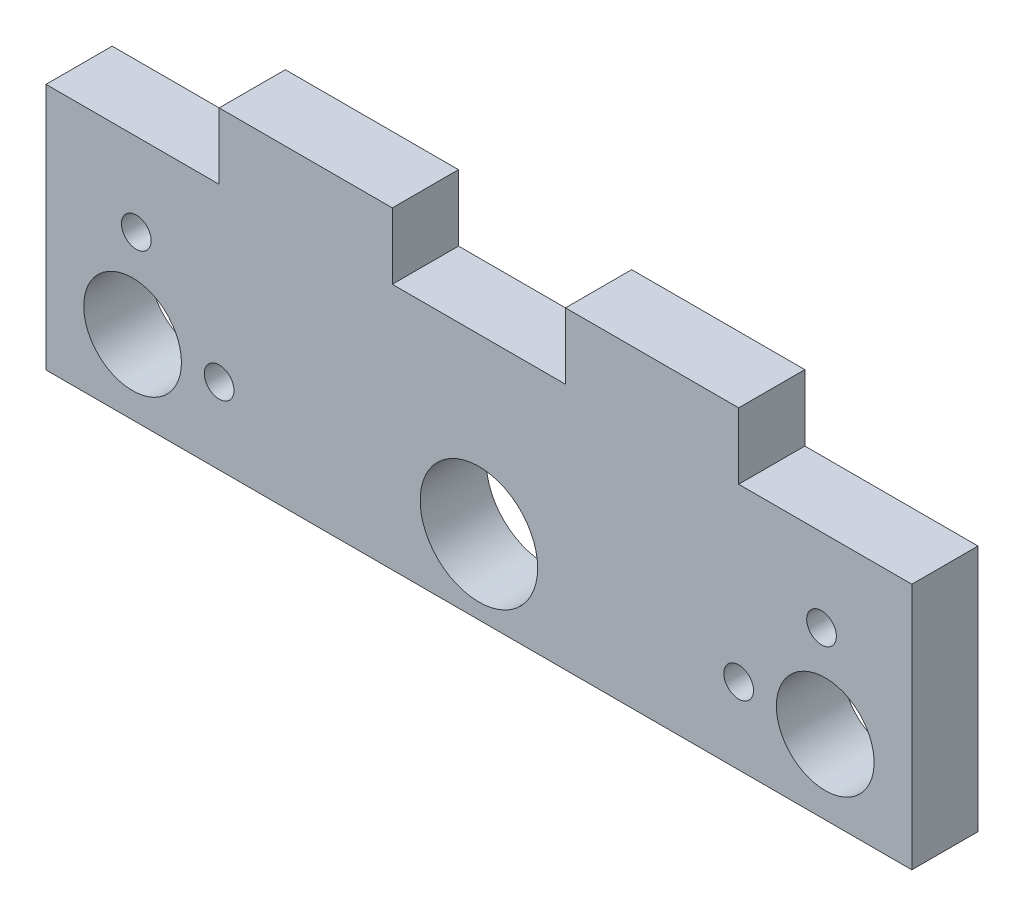
ISO-10303-21;
HEADER;
FILE_DESCRIPTION(('STEP AP214'),'2;1');
FILE_NAME('part.step','',(''),(''),'','','');
FILE_SCHEMA(('AUTOMOTIVE_DESIGN { 1 0 10303 214 1 1 1 1 }'));
ENDSEC;
DATA;
#1=APPLICATION_CONTEXT('core data for automotive mechanical design processes');
#2=APPLICATION_PROTOCOL_DEFINITION('international standard','automotive_design',2000,#1);
#3=PRODUCT_CONTEXT('',#1,'mechanical');
#4=PRODUCT('Part','Part','',(#3));
#5=PRODUCT_RELATED_PRODUCT_CATEGORY('part','',(#4));
#6=PRODUCT_DEFINITION_FORMATION('','',#4);
#7=PRODUCT_DEFINITION_CONTEXT('part definition',#1,'design');
#8=PRODUCT_DEFINITION('design','',#6,#7);
#9=PRODUCT_DEFINITION_SHAPE('','',#8);
#10=(LENGTH_UNIT() NAMED_UNIT(*) SI_UNIT(.MILLI.,.METRE.));
#11=(NAMED_UNIT(*) PLANE_ANGLE_UNIT() SI_UNIT($,.RADIAN.));
#12=(NAMED_UNIT(*) SI_UNIT($,.STERADIAN.) SOLID_ANGLE_UNIT());
#13=UNCERTAINTY_MEASURE_WITH_UNIT(LENGTH_MEASURE(1.E-05),#10,'distance_accuracy_value','');
#14=(GEOMETRIC_REPRESENTATION_CONTEXT(3) GLOBAL_UNCERTAINTY_ASSIGNED_CONTEXT((#13)) GLOBAL_UNIT_ASSIGNED_CONTEXT((#10,
#11,#12)) REPRESENTATION_CONTEXT('',''));
#15=CARTESIAN_POINT('',(0.,0.,0.));
#16=DIRECTION('',(0.,0.,1.));
#17=DIRECTION('',(1.,0.,0.));
#18=AXIS2_PLACEMENT_3D('',#15,#16,#17);
#19=CARTESIAN_POINT('',(0.,0.,5.35));
#20=DIRECTION('',(0.,0.,-1.));
#21=DIRECTION('',(-1.,0.,0.));
#22=AXIS2_PLACEMENT_3D('',#19,#20,#21);
#23=PLANE('',#22);
#24=DIRECTION('',(0.,-1.,0.));
#25=VECTOR('',#24,1.);
#26=CARTESIAN_POINT('',(-35.,0.,5.35));
#27=LINE('',#26,#25);
#28=CARTESIAN_POINT('',(-35.,20.,5.35));
#29=VERTEX_POINT('',#28);
#30=CARTESIAN_POINT('',(-35.,0.,5.35));
#31=VERTEX_POINT('',#30);
#32=EDGE_CURVE('E176',#29,#31,#27,.T.);
#33=ORIENTED_EDGE('',*,*,#32,.T.);
#34=DIRECTION('',(1.,0.,0.));
#35=VECTOR('',#34,1.);
#36=CARTESIAN_POINT('',(-35.,0.,5.35));
#37=LINE('',#36,#35);
#38=CARTESIAN_POINT('',(35.,0.,5.35));
#39=VERTEX_POINT('',#38);
#40=EDGE_CURVE('E104',#31,#39,#37,.T.);
#41=ORIENTED_EDGE('',*,*,#40,.T.);
#42=DIRECTION('',(0.,1.,0.));
#43=VECTOR('',#42,1.);
#44=CARTESIAN_POINT('',(35.,0.,5.35));
#45=LINE('',#44,#43);
#46=CARTESIAN_POINT('',(35.,20.,5.35));
#47=VERTEX_POINT('',#46);
#48=EDGE_CURVE('E203',#39,#47,#45,.T.);
#49=ORIENTED_EDGE('',*,*,#48,.T.);
#50=DIRECTION('',(-1.,0.,0.));
#51=VECTOR('',#50,1.);
#52=CARTESIAN_POINT('',(21.,20.,5.35));
#53=LINE('',#52,#51);
#54=CARTESIAN_POINT('',(21.,20.,5.35));
#55=VERTEX_POINT('',#54);
#56=EDGE_CURVE('E222',#47,#55,#53,.T.);
#57=ORIENTED_EDGE('',*,*,#56,.T.);
#58=DIRECTION('',(0.,1.,0.));
#59=VECTOR('',#58,1.);
#60=CARTESIAN_POINT('',(21.,20.,5.35));
#61=LINE('',#60,#59);
#62=CARTESIAN_POINT('',(21.,25.35,5.35));
#63=VERTEX_POINT('',#62);
#64=EDGE_CURVE('E219',#55,#63,#61,.T.);
#65=ORIENTED_EDGE('',*,*,#64,.T.);
#66=DIRECTION('',(-1.,0.,0.));
#67=VECTOR('',#66,1.);
#68=CARTESIAN_POINT('',(21.,25.35,5.35));
#69=LINE('',#68,#67);
#70=CARTESIAN_POINT('',(7.,25.35,5.35));
#71=VERTEX_POINT('',#70);
#72=EDGE_CURVE('E221',#63,#71,#69,.T.);
#73=ORIENTED_EDGE('',*,*,#72,.T.);
#74=DIRECTION('',(0.,-1.,0.));
#75=VECTOR('',#74,1.);
#76=CARTESIAN_POINT('',(7.,20.,5.35));
#77=LINE('',#76,#75);
#78=CARTESIAN_POINT('',(7.,20.,5.35));
#79=VERTEX_POINT('',#78);
#80=EDGE_CURVE('E224',#71,#79,#77,.T.);
#81=ORIENTED_EDGE('',*,*,#80,.T.);
#82=DIRECTION('',(-1.,0.,0.));
#83=VECTOR('',#82,1.);
#84=CARTESIAN_POINT('',(-7.,20.,5.35));
#85=LINE('',#84,#83);
#86=CARTESIAN_POINT('',(-7.,20.,5.35));
#87=VERTEX_POINT('',#86);
#88=EDGE_CURVE('E230',#79,#87,#85,.T.);
#89=ORIENTED_EDGE('',*,*,#88,.T.);
#90=DIRECTION('',(0.,1.,0.));
#91=VECTOR('',#90,1.);
#92=CARTESIAN_POINT('',(-7.,20.,5.35));
#93=LINE('',#92,#91);
#94=CARTESIAN_POINT('',(-7.,25.35,5.35));
#95=VERTEX_POINT('',#94);
#96=EDGE_CURVE('E135',#87,#95,#93,.T.);
#97=ORIENTED_EDGE('',*,*,#96,.T.);
#98=DIRECTION('',(-1.,0.,0.));
#99=VECTOR('',#98,1.);
#100=CARTESIAN_POINT('',(-21.,25.35,5.35));
#101=LINE('',#100,#99);
#102=CARTESIAN_POINT('',(-21.,25.35,5.35));
#103=VERTEX_POINT('',#102);
#104=EDGE_CURVE('E129',#95,#103,#101,.T.);
#105=ORIENTED_EDGE('',*,*,#104,.T.);
#106=DIRECTION('',(0.,-1.,0.));
#107=VECTOR('',#106,1.);
#108=CARTESIAN_POINT('',(-21.,20.,5.35));
#109=LINE('',#108,#107);
#110=CARTESIAN_POINT('',(-21.,20.,5.35));
#111=VERTEX_POINT('',#110);
#112=EDGE_CURVE('E133',#103,#111,#109,.T.);
#113=ORIENTED_EDGE('',*,*,#112,.T.);
#114=DIRECTION('',(-1.,0.,0.));
#115=VECTOR('',#114,1.);
#116=CARTESIAN_POINT('',(-35.,20.,5.35));
#117=LINE('',#116,#115);
#118=EDGE_CURVE('E49',#111,#29,#117,.T.);
#119=ORIENTED_EDGE('',*,*,#118,.T.);
#120=EDGE_LOOP('',(#33,#41,#49,#57,#65,#73,#81,#89,#97,#105,#113,#119));
#121=FACE_BOUND('',#120,.T.);
#122=CARTESIAN_POINT('',(0.,6.,5.35));
#123=DIRECTION('',(0.,0.,1.));
#124=DIRECTION('',(1.,0.,0.));
#125=AXIS2_PLACEMENT_3D('',#122,#123,#124);
#126=CIRCLE('',#125,4.75);
#127=CARTESIAN_POINT('',(4.75,6.,5.35));
#128=VERTEX_POINT('',#127);
#129=EDGE_CURVE('E157',#128,#128,#126,.T.);
#130=ORIENTED_EDGE('',*,*,#129,.F.);
#131=EDGE_LOOP('',(#130));
#132=FACE_BOUND('',#131,.T.);
#133=CARTESIAN_POINT('',(-28.,6.,5.35));
#134=DIRECTION('',(0.,0.,1.));
#135=DIRECTION('',(1.,0.,0.));
#136=AXIS2_PLACEMENT_3D('',#133,#134,#135);
#137=CIRCLE('',#136,3.95);
#138=CARTESIAN_POINT('',(-24.05,6.,5.35));
#139=VERTEX_POINT('',#138);
#140=EDGE_CURVE('E324',#139,#139,#137,.T.);
#141=ORIENTED_EDGE('',*,*,#140,.F.);
#142=EDGE_LOOP('',(#141));
#143=FACE_BOUND('',#142,.T.);
#144=CARTESIAN_POINT('',(-27.7,13.3,5.35));
#145=DIRECTION('',(0.,0.,1.));
#146=DIRECTION('',(1.,0.,0.));
#147=AXIS2_PLACEMENT_3D('',#144,#145,#146);
#148=CIRCLE('',#147,1.2);
#149=CARTESIAN_POINT('',(-26.5,13.3,5.35));
#150=VERTEX_POINT('',#149);
#151=EDGE_CURVE('E318',#150,#150,#148,.T.);
#152=ORIENTED_EDGE('',*,*,#151,.F.);
#153=EDGE_LOOP('',(#152));
#154=FACE_BOUND('',#153,.T.);
#155=CARTESIAN_POINT('',(-21.,6.16,5.35));
#156=DIRECTION('',(0.,0.,1.));
#157=DIRECTION('',(1.,0.,0.));
#158=AXIS2_PLACEMENT_3D('',#155,#156,#157);
#159=CIRCLE('',#158,1.2);
#160=CARTESIAN_POINT('',(-19.8,6.16,5.35));
#161=VERTEX_POINT('',#160);
#162=EDGE_CURVE('E312',#161,#161,#159,.T.);
#163=ORIENTED_EDGE('',*,*,#162,.F.);
#164=EDGE_LOOP('',(#163));
#165=FACE_BOUND('',#164,.T.);
#166=CARTESIAN_POINT('',(21.,6.16,5.35));
#167=DIRECTION('',(0.,0.,1.));
#168=DIRECTION('',(-1.,0.,0.));
#169=AXIS2_PLACEMENT_3D('',#166,#167,#168);
#170=CIRCLE('',#169,1.2);
#171=CARTESIAN_POINT('',(19.8,6.16,5.35));
#172=VERTEX_POINT('',#171);
#173=EDGE_CURVE('E306',#172,#172,#170,.T.);
#174=ORIENTED_EDGE('',*,*,#173,.F.);
#175=EDGE_LOOP('',(#174));
#176=FACE_BOUND('',#175,.T.);
#177=CARTESIAN_POINT('',(28.,6.,5.35));
#178=DIRECTION('',(0.,0.,1.));
#179=DIRECTION('',(-1.,0.,0.));
#180=AXIS2_PLACEMENT_3D('',#177,#178,#179);
#181=CIRCLE('',#180,3.95);
#182=CARTESIAN_POINT('',(24.05,6.,5.35));
#183=VERTEX_POINT('',#182);
#184=EDGE_CURVE('E300',#183,#183,#181,.T.);
#185=ORIENTED_EDGE('',*,*,#184,.F.);
#186=EDGE_LOOP('',(#185));
#187=FACE_BOUND('',#186,.T.);
#188=CARTESIAN_POINT('',(27.7,13.3,5.35));
#189=DIRECTION('',(0.,0.,1.));
#190=DIRECTION('',(-1.,0.,0.));
#191=AXIS2_PLACEMENT_3D('',#188,#189,#190);
#192=CIRCLE('',#191,1.2);
#193=CARTESIAN_POINT('',(26.5,13.3,5.35));
#194=VERTEX_POINT('',#193);
#195=EDGE_CURVE('E291',#194,#194,#192,.T.);
#196=ORIENTED_EDGE('',*,*,#195,.F.);
#197=EDGE_LOOP('',(#196));
#198=FACE_BOUND('',#197,.T.);
#199=ADVANCED_FACE('F32',(#121,#132,#143,#154,#165,#176,#187,#198),#23,.F.);
#200=CARTESIAN_POINT('',(0.,0.,0.));
#201=DIRECTION('',(0.,0.,-1.));
#202=DIRECTION('',(-1.,0.,0.));
#203=AXIS2_PLACEMENT_3D('',#200,#201,#202);
#204=PLANE('',#203);
#205=CARTESIAN_POINT('',(28.,6.,0.));
#206=DIRECTION('',(0.,0.,1.));
#207=DIRECTION('',(-1.,0.,0.));
#208=AXIS2_PLACEMENT_3D('',#205,#206,#207);
#209=CIRCLE('',#208,3.95);
#210=CARTESIAN_POINT('',(24.05,6.,0.));
#211=VERTEX_POINT('',#210);
#212=EDGE_CURVE('E297',#211,#211,#209,.T.);
#213=ORIENTED_EDGE('',*,*,#212,.T.);
#214=EDGE_LOOP('',(#213));
#215=FACE_BOUND('',#214,.T.);
#216=CARTESIAN_POINT('',(-21.,6.16,0.));
#217=DIRECTION('',(0.,0.,1.));
#218=DIRECTION('',(1.,0.,0.));
#219=AXIS2_PLACEMENT_3D('',#216,#217,#218);
#220=CIRCLE('',#219,1.2);
#221=CARTESIAN_POINT('',(-19.8,6.16,0.));
#222=VERTEX_POINT('',#221);
#223=EDGE_CURVE('E309',#222,#222,#220,.T.);
#224=ORIENTED_EDGE('',*,*,#223,.T.);
#225=EDGE_LOOP('',(#224));
#226=FACE_BOUND('',#225,.T.);
#227=CARTESIAN_POINT('',(-28.,6.,0.));
#228=DIRECTION('',(0.,0.,1.));
#229=DIRECTION('',(1.,0.,0.));
#230=AXIS2_PLACEMENT_3D('',#227,#228,#229);
#231=CIRCLE('',#230,3.95);
#232=CARTESIAN_POINT('',(-24.05,6.,0.));
#233=VERTEX_POINT('',#232);
#234=EDGE_CURVE('E321',#233,#233,#231,.T.);
#235=ORIENTED_EDGE('',*,*,#234,.T.);
#236=EDGE_LOOP('',(#235));
#237=FACE_BOUND('',#236,.T.);
#238=DIRECTION('',(0.,-1.,0.));
#239=VECTOR('',#238,1.);
#240=CARTESIAN_POINT('',(-35.,0.,0.));
#241=LINE('',#240,#239);
#242=CARTESIAN_POINT('',(-35.,20.,0.));
#243=VERTEX_POINT('',#242);
#244=CARTESIAN_POINT('',(-35.,0.,0.));
#245=VERTEX_POINT('',#244);
#246=EDGE_CURVE('E153',#243,#245,#241,.T.);
#247=ORIENTED_EDGE('',*,*,#246,.F.);
#248=DIRECTION('',(-1.,0.,0.));
#249=VECTOR('',#248,1.);
#250=CARTESIAN_POINT('',(-35.,20.,0.));
#251=LINE('',#250,#249);
#252=CARTESIAN_POINT('',(-21.,20.,0.));
#253=VERTEX_POINT('',#252);
#254=EDGE_CURVE('E96',#253,#243,#251,.T.);
#255=ORIENTED_EDGE('',*,*,#254,.F.);
#256=DIRECTION('',(0.,-1.,0.));
#257=VECTOR('',#256,1.);
#258=CARTESIAN_POINT('',(-21.,20.,0.));
#259=LINE('',#258,#257);
#260=CARTESIAN_POINT('',(-21.,25.35,0.));
#261=VERTEX_POINT('',#260);
#262=EDGE_CURVE('E90',#261,#253,#259,.T.);
#263=ORIENTED_EDGE('',*,*,#262,.F.);
#264=DIRECTION('',(-1.,0.,0.));
#265=VECTOR('',#264,1.);
#266=CARTESIAN_POINT('',(-21.,25.35,0.));
#267=LINE('',#266,#265);
#268=CARTESIAN_POINT('',(-7.,25.35,0.));
#269=VERTEX_POINT('',#268);
#270=EDGE_CURVE('E143',#269,#261,#267,.T.);
#271=ORIENTED_EDGE('',*,*,#270,.F.);
#272=DIRECTION('',(0.,1.,0.));
#273=VECTOR('',#272,1.);
#274=CARTESIAN_POINT('',(-7.,20.,0.));
#275=LINE('',#274,#273);
#276=CARTESIAN_POINT('',(-7.,20.,0.));
#277=VERTEX_POINT('',#276);
#278=EDGE_CURVE('E171',#277,#269,#275,.T.);
#279=ORIENTED_EDGE('',*,*,#278,.F.);
#280=DIRECTION('',(-1.,0.,0.));
#281=VECTOR('',#280,1.);
#282=CARTESIAN_POINT('',(-7.,20.,0.));
#283=LINE('',#282,#281);
#284=CARTESIAN_POINT('',(7.,20.,0.));
#285=VERTEX_POINT('',#284);
#286=EDGE_CURVE('E169',#285,#277,#283,.T.);
#287=ORIENTED_EDGE('',*,*,#286,.F.);
#288=DIRECTION('',(0.,-1.,0.));
#289=VECTOR('',#288,1.);
#290=CARTESIAN_POINT('',(7.,20.,0.));
#291=LINE('',#290,#289);
#292=CARTESIAN_POINT('',(7.,25.35,0.));
#293=VERTEX_POINT('',#292);
#294=EDGE_CURVE('E167',#293,#285,#291,.T.);
#295=ORIENTED_EDGE('',*,*,#294,.F.);
#296=DIRECTION('',(-1.,0.,0.));
#297=VECTOR('',#296,1.);
#298=CARTESIAN_POINT('',(21.,25.35,0.));
#299=LINE('',#298,#297);
#300=CARTESIAN_POINT('',(21.,25.35,0.));
#301=VERTEX_POINT('',#300);
#302=EDGE_CURVE('E165',#301,#293,#299,.T.);
#303=ORIENTED_EDGE('',*,*,#302,.F.);
#304=DIRECTION('',(0.,1.,0.));
#305=VECTOR('',#304,1.);
#306=CARTESIAN_POINT('',(21.,20.,0.));
#307=LINE('',#306,#305);
#308=CARTESIAN_POINT('',(21.,20.,0.));
#309=VERTEX_POINT('',#308);
#310=EDGE_CURVE('E163',#309,#301,#307,.T.);
#311=ORIENTED_EDGE('',*,*,#310,.F.);
#312=DIRECTION('',(-1.,0.,0.));
#313=VECTOR('',#312,1.);
#314=CARTESIAN_POINT('',(21.,20.,0.));
#315=LINE('',#314,#313);
#316=CARTESIAN_POINT('',(35.,20.,0.));
#317=VERTEX_POINT('',#316);
#318=EDGE_CURVE('E161',#317,#309,#315,.T.);
#319=ORIENTED_EDGE('',*,*,#318,.F.);
#320=DIRECTION('',(0.,1.,0.));
#321=VECTOR('',#320,1.);
#322=CARTESIAN_POINT('',(35.,0.,0.));
#323=LINE('',#322,#321);
#324=CARTESIAN_POINT('',(35.,0.,0.));
#325=VERTEX_POINT('',#324);
#326=EDGE_CURVE('E159',#325,#317,#323,.T.);
#327=ORIENTED_EDGE('',*,*,#326,.F.);
#328=DIRECTION('',(1.,0.,0.));
#329=VECTOR('',#328,1.);
#330=CARTESIAN_POINT('',(-35.,0.,0.));
#331=LINE('',#330,#329);
#332=EDGE_CURVE('E156',#245,#325,#331,.T.);
#333=ORIENTED_EDGE('',*,*,#332,.F.);
#334=EDGE_LOOP('',(#247,#255,#263,#271,#279,#287,#295,#303,#311,#319,#327,#333));
#335=FACE_BOUND('',#334,.T.);
#336=CARTESIAN_POINT('',(0.,6.,0.));
#337=DIRECTION('',(0.,0.,1.));
#338=DIRECTION('',(1.,0.,0.));
#339=AXIS2_PLACEMENT_3D('',#336,#337,#338);
#340=CIRCLE('',#339,4.75);
#341=CARTESIAN_POINT('',(4.75,6.,0.));
#342=VERTEX_POINT('',#341);
#343=EDGE_CURVE('E327',#342,#342,#340,.T.);
#344=ORIENTED_EDGE('',*,*,#343,.T.);
#345=EDGE_LOOP('',(#344));
#346=FACE_BOUND('',#345,.T.);
#347=CARTESIAN_POINT('',(-27.7,13.3,0.));
#348=DIRECTION('',(0.,0.,1.));
#349=DIRECTION('',(1.,0.,0.));
#350=AXIS2_PLACEMENT_3D('',#347,#348,#349);
#351=CIRCLE('',#350,1.2);
#352=CARTESIAN_POINT('',(-26.5,13.3,0.));
#353=VERTEX_POINT('',#352);
#354=EDGE_CURVE('E315',#353,#353,#351,.T.);
#355=ORIENTED_EDGE('',*,*,#354,.T.);
#356=EDGE_LOOP('',(#355));
#357=FACE_BOUND('',#356,.T.);
#358=CARTESIAN_POINT('',(21.,6.16,0.));
#359=DIRECTION('',(0.,0.,1.));
#360=DIRECTION('',(-1.,0.,0.));
#361=AXIS2_PLACEMENT_3D('',#358,#359,#360);
#362=CIRCLE('',#361,1.2);
#363=CARTESIAN_POINT('',(19.8,6.16,0.));
#364=VERTEX_POINT('',#363);
#365=EDGE_CURVE('E303',#364,#364,#362,.T.);
#366=ORIENTED_EDGE('',*,*,#365,.T.);
#367=EDGE_LOOP('',(#366));
#368=FACE_BOUND('',#367,.T.);
#369=CARTESIAN_POINT('',(27.7,13.3,0.));
#370=DIRECTION('',(0.,0.,1.));
#371=DIRECTION('',(-1.,0.,0.));
#372=AXIS2_PLACEMENT_3D('',#369,#370,#371);
#373=CIRCLE('',#372,1.2);
#374=CARTESIAN_POINT('',(26.5,13.3,0.));
#375=VERTEX_POINT('',#374);
#376=EDGE_CURVE('E294',#375,#375,#373,.T.);
#377=ORIENTED_EDGE('',*,*,#376,.T.);
#378=EDGE_LOOP('',(#377));
#379=FACE_BOUND('',#378,.T.);
#380=ADVANCED_FACE('F207',(#215,#226,#237,#335,#346,#357,#368,#379),#204,.T.);
#381=CARTESIAN_POINT('',(-35.,0.,5.35));
#382=DIRECTION('',(1.,0.,0.));
#383=DIRECTION('',(0.,0.,-1.));
#384=AXIS2_PLACEMENT_3D('',#381,#382,#383);
#385=PLANE('',#384);
#386=ORIENTED_EDGE('',*,*,#246,.T.);
#387=DIRECTION('',(0.,0.,-1.));
#388=VECTOR('',#387,1.);
#389=CARTESIAN_POINT('',(-35.,0.,5.35));
#390=LINE('',#389,#388);
#391=EDGE_CURVE('E11',#31,#245,#390,.T.);
#392=ORIENTED_EDGE('',*,*,#391,.F.);
#393=ORIENTED_EDGE('',*,*,#32,.F.);
#394=DIRECTION('',(0.,0.,-1.));
#395=VECTOR('',#394,1.);
#396=CARTESIAN_POINT('',(-35.,20.,5.35));
#397=LINE('',#396,#395);
#398=EDGE_CURVE('E149',#29,#243,#397,.T.);
#399=ORIENTED_EDGE('',*,*,#398,.T.);
#400=EDGE_LOOP('',(#386,#392,#393,#399));
#401=FACE_BOUND('',#400,.T.);
#402=ADVANCED_FACE('F34',(#401),#385,.F.);
#403=CARTESIAN_POINT('',(-35.,0.,5.35));
#404=DIRECTION('',(0.,1.,0.));
#405=DIRECTION('',(0.,0.,1.));
#406=AXIS2_PLACEMENT_3D('',#403,#404,#405);
#407=PLANE('',#406);
#408=ORIENTED_EDGE('',*,*,#332,.T.);
#409=DIRECTION('',(0.,0.,-1.));
#410=VECTOR('',#409,1.);
#411=CARTESIAN_POINT('',(35.,0.,5.35));
#412=LINE('',#411,#410);
#413=EDGE_CURVE('E41',#39,#325,#412,.T.);
#414=ORIENTED_EDGE('',*,*,#413,.F.);
#415=ORIENTED_EDGE('',*,*,#40,.F.);
#416=ORIENTED_EDGE('',*,*,#391,.T.);
#417=EDGE_LOOP('',(#408,#414,#415,#416));
#418=FACE_BOUND('',#417,.T.);
#419=ADVANCED_FACE('F466',(#418),#407,.F.);
#420=CARTESIAN_POINT('',(35.,0.,5.35));
#421=DIRECTION('',(-1.,0.,0.));
#422=DIRECTION('',(0.,0.,1.));
#423=AXIS2_PLACEMENT_3D('',#420,#421,#422);
#424=PLANE('',#423);
#425=ORIENTED_EDGE('',*,*,#326,.T.);
#426=DIRECTION('',(0.,0.,-1.));
#427=VECTOR('',#426,1.);
#428=CARTESIAN_POINT('',(35.,20.,5.35));
#429=LINE('',#428,#427);
#430=EDGE_CURVE('E195',#47,#317,#429,.T.);
#431=ORIENTED_EDGE('',*,*,#430,.F.);
#432=ORIENTED_EDGE('',*,*,#48,.F.);
#433=ORIENTED_EDGE('',*,*,#413,.T.);
#434=EDGE_LOOP('',(#425,#431,#432,#433));
#435=FACE_BOUND('',#434,.T.);
#436=ADVANCED_FACE('F201',(#435),#424,.F.);
#437=CARTESIAN_POINT('',(21.,20.,5.35));
#438=DIRECTION('',(0.,-1.,0.));
#439=DIRECTION('',(0.,0.,-1.));
#440=AXIS2_PLACEMENT_3D('',#437,#438,#439);
#441=PLANE('',#440);
#442=ORIENTED_EDGE('',*,*,#318,.T.);
#443=DIRECTION('',(0.,0.,-1.));
#444=VECTOR('',#443,1.);
#445=CARTESIAN_POINT('',(21.,20.,5.35));
#446=LINE('',#445,#444);
#447=EDGE_CURVE('E192',#55,#309,#446,.T.);
#448=ORIENTED_EDGE('',*,*,#447,.F.);
#449=ORIENTED_EDGE('',*,*,#56,.F.);
#450=ORIENTED_EDGE('',*,*,#430,.T.);
#451=EDGE_LOOP('',(#442,#448,#449,#450));
#452=FACE_BOUND('',#451,.T.);
#453=ADVANCED_FACE('F213',(#452),#441,.F.);
#454=CARTESIAN_POINT('',(21.,20.,5.35));
#455=DIRECTION('',(-1.,0.,0.));
#456=DIRECTION('',(0.,-1.,0.));
#457=AXIS2_PLACEMENT_3D('',#454,#455,#456);
#458=PLANE('',#457);
#459=ORIENTED_EDGE('',*,*,#310,.T.);
#460=DIRECTION('',(0.,0.,-1.));
#461=VECTOR('',#460,1.);
#462=CARTESIAN_POINT('',(21.,25.35,5.35));
#463=LINE('',#462,#461);
#464=EDGE_CURVE('E189',#63,#301,#463,.T.);
#465=ORIENTED_EDGE('',*,*,#464,.F.);
#466=ORIENTED_EDGE('',*,*,#64,.F.);
#467=ORIENTED_EDGE('',*,*,#447,.T.);
#468=EDGE_LOOP('',(#459,#465,#466,#467));
#469=FACE_BOUND('',#468,.T.);
#470=ADVANCED_FACE('F217',(#469),#458,.F.);
#471=CARTESIAN_POINT('',(21.,25.35,5.35));
#472=DIRECTION('',(0.,-1.,0.));
#473=DIRECTION('',(0.,0.,-1.));
#474=AXIS2_PLACEMENT_3D('',#471,#472,#473);
#475=PLANE('',#474);
#476=ORIENTED_EDGE('',*,*,#302,.T.);
#477=DIRECTION('',(0.,0.,-1.));
#478=VECTOR('',#477,1.);
#479=CARTESIAN_POINT('',(7.,25.35,5.35));
#480=LINE('',#479,#478);
#481=EDGE_CURVE('E186',#71,#293,#480,.T.);
#482=ORIENTED_EDGE('',*,*,#481,.F.);
#483=ORIENTED_EDGE('',*,*,#72,.F.);
#484=ORIENTED_EDGE('',*,*,#464,.T.);
#485=EDGE_LOOP('',(#476,#482,#483,#484));
#486=FACE_BOUND('',#485,.T.);
#487=ADVANCED_FACE('F431',(#486),#475,.F.);
#488=CARTESIAN_POINT('',(7.,20.,5.35));
#489=DIRECTION('',(1.,0.,0.));
#490=DIRECTION('',(0.,1.,0.));
#491=AXIS2_PLACEMENT_3D('',#488,#489,#490);
#492=PLANE('',#491);
#493=ORIENTED_EDGE('',*,*,#294,.T.);
#494=DIRECTION('',(0.,0.,-1.));
#495=VECTOR('',#494,1.);
#496=CARTESIAN_POINT('',(7.,20.,5.35));
#497=LINE('',#496,#495);
#498=EDGE_CURVE('E183',#79,#285,#497,.T.);
#499=ORIENTED_EDGE('',*,*,#498,.F.);
#500=ORIENTED_EDGE('',*,*,#80,.F.);
#501=ORIENTED_EDGE('',*,*,#481,.T.);
#502=EDGE_LOOP('',(#493,#499,#500,#501));
#503=FACE_BOUND('',#502,.T.);
#504=ADVANCED_FACE('F422',(#503),#492,.F.);
#505=CARTESIAN_POINT('',(-7.,20.,5.35));
#506=DIRECTION('',(0.,-1.,0.));
#507=DIRECTION('',(0.,0.,-1.));
#508=AXIS2_PLACEMENT_3D('',#505,#506,#507);
#509=PLANE('',#508);
#510=ORIENTED_EDGE('',*,*,#286,.T.);
#511=DIRECTION('',(0.,0.,-1.));
#512=VECTOR('',#511,1.);
#513=CARTESIAN_POINT('',(-7.,20.,5.35));
#514=LINE('',#513,#512);
#515=EDGE_CURVE('E180',#87,#277,#514,.T.);
#516=ORIENTED_EDGE('',*,*,#515,.F.);
#517=ORIENTED_EDGE('',*,*,#88,.F.);
#518=ORIENTED_EDGE('',*,*,#498,.T.);
#519=EDGE_LOOP('',(#510,#516,#517,#518));
#520=FACE_BOUND('',#519,.T.);
#521=ADVANCED_FACE('F236',(#520),#509,.F.);
#522=CARTESIAN_POINT('',(-7.,20.,5.35));
#523=DIRECTION('',(-1.,0.,0.));
#524=DIRECTION('',(0.,-1.,0.));
#525=AXIS2_PLACEMENT_3D('',#522,#523,#524);
#526=PLANE('',#525);
#527=ORIENTED_EDGE('',*,*,#278,.T.);
#528=DIRECTION('',(0.,0.,-1.));
#529=VECTOR('',#528,1.);
#530=CARTESIAN_POINT('',(-7.,25.35,5.35));
#531=LINE('',#530,#529);
#532=EDGE_CURVE('E144',#95,#269,#531,.T.);
#533=ORIENTED_EDGE('',*,*,#532,.F.);
#534=ORIENTED_EDGE('',*,*,#96,.F.);
#535=ORIENTED_EDGE('',*,*,#515,.T.);
#536=EDGE_LOOP('',(#527,#533,#534,#535));
#537=FACE_BOUND('',#536,.T.);
#538=ADVANCED_FACE('F240',(#537),#526,.F.);
#539=CARTESIAN_POINT('',(-21.,25.35,5.35));
#540=DIRECTION('',(0.,-1.,0.));
#541=DIRECTION('',(0.,0.,-1.));
#542=AXIS2_PLACEMENT_3D('',#539,#540,#541);
#543=PLANE('',#542);
#544=ORIENTED_EDGE('',*,*,#270,.T.);
#545=DIRECTION('',(0.,0.,-1.));
#546=VECTOR('',#545,1.);
#547=CARTESIAN_POINT('',(-21.,25.35,5.35));
#548=LINE('',#547,#546);
#549=EDGE_CURVE('E140',#103,#261,#548,.T.);
#550=ORIENTED_EDGE('',*,*,#549,.F.);
#551=ORIENTED_EDGE('',*,*,#104,.F.);
#552=ORIENTED_EDGE('',*,*,#532,.T.);
#553=EDGE_LOOP('',(#544,#550,#551,#552));
#554=FACE_BOUND('',#553,.T.);
#555=ADVANCED_FACE('F141',(#554),#543,.F.);
#556=CARTESIAN_POINT('',(-21.,20.,5.35));
#557=DIRECTION('',(1.,0.,0.));
#558=DIRECTION('',(0.,1.,0.));
#559=AXIS2_PLACEMENT_3D('',#556,#557,#558);
#560=PLANE('',#559);
#561=ORIENTED_EDGE('',*,*,#262,.T.);
#562=DIRECTION('',(0.,0.,-1.));
#563=VECTOR('',#562,1.);
#564=CARTESIAN_POINT('',(-21.,20.,5.35));
#565=LINE('',#564,#563);
#566=EDGE_CURVE('E145',#111,#253,#565,.T.);
#567=ORIENTED_EDGE('',*,*,#566,.F.);
#568=ORIENTED_EDGE('',*,*,#112,.F.);
#569=ORIENTED_EDGE('',*,*,#549,.T.);
#570=EDGE_LOOP('',(#561,#567,#568,#569));
#571=FACE_BOUND('',#570,.T.);
#572=ADVANCED_FACE('F147',(#571),#560,.F.);
#573=CARTESIAN_POINT('',(-35.,20.,5.35));
#574=DIRECTION('',(0.,-1.,0.));
#575=DIRECTION('',(0.,0.,-1.));
#576=AXIS2_PLACEMENT_3D('',#573,#574,#575);
#577=PLANE('',#576);
#578=ORIENTED_EDGE('',*,*,#254,.T.);
#579=ORIENTED_EDGE('',*,*,#398,.F.);
#580=ORIENTED_EDGE('',*,*,#118,.F.);
#581=ORIENTED_EDGE('',*,*,#566,.T.);
#582=EDGE_LOOP('',(#578,#579,#580,#581));
#583=FACE_BOUND('',#582,.T.);
#584=ADVANCED_FACE('F244',(#583),#577,.F.);
#585=CARTESIAN_POINT('',(0.,6.,5.35));
#586=DIRECTION('',(0.,0.,-1.));
#587=DIRECTION('',(-1.,0.,0.));
#588=AXIS2_PLACEMENT_3D('',#585,#586,#587);
#589=CYLINDRICAL_SURFACE('',#588,4.75);
#590=ORIENTED_EDGE('',*,*,#129,.T.);
#591=EDGE_LOOP('',(#590));
#592=FACE_BOUND('',#591,.T.);
#593=ORIENTED_EDGE('',*,*,#343,.F.);
#594=EDGE_LOOP('',(#593));
#595=FACE_BOUND('',#594,.T.);
#596=ADVANCED_FACE('F246',(#592,#595),#589,.F.);
#597=CARTESIAN_POINT('',(-28.,6.,5.35));
#598=DIRECTION('',(0.,0.,-1.));
#599=DIRECTION('',(-1.,0.,0.));
#600=AXIS2_PLACEMENT_3D('',#597,#598,#599);
#601=CYLINDRICAL_SURFACE('',#600,3.95);
#602=ORIENTED_EDGE('',*,*,#140,.T.);
#603=EDGE_LOOP('',(#602));
#604=FACE_BOUND('',#603,.T.);
#605=ORIENTED_EDGE('',*,*,#234,.F.);
#606=EDGE_LOOP('',(#605));
#607=FACE_BOUND('',#606,.T.);
#608=ADVANCED_FACE('F252',(#604,#607),#601,.F.);
#609=CARTESIAN_POINT('',(-27.7,13.3,5.35));
#610=DIRECTION('',(0.,0.,-1.));
#611=DIRECTION('',(-1.,0.,0.));
#612=AXIS2_PLACEMENT_3D('',#609,#610,#611);
#613=CYLINDRICAL_SURFACE('',#612,1.2);
#614=ORIENTED_EDGE('',*,*,#151,.T.);
#615=EDGE_LOOP('',(#614));
#616=FACE_BOUND('',#615,.T.);
#617=ORIENTED_EDGE('',*,*,#354,.F.);
#618=EDGE_LOOP('',(#617));
#619=FACE_BOUND('',#618,.T.);
#620=ADVANCED_FACE('F266',(#616,#619),#613,.F.);
#621=CARTESIAN_POINT('',(-21.,6.16,5.35));
#622=DIRECTION('',(0.,0.,-1.));
#623=DIRECTION('',(-1.,0.,0.));
#624=AXIS2_PLACEMENT_3D('',#621,#622,#623);
#625=CYLINDRICAL_SURFACE('',#624,1.2);
#626=ORIENTED_EDGE('',*,*,#162,.T.);
#627=EDGE_LOOP('',(#626));
#628=FACE_BOUND('',#627,.T.);
#629=ORIENTED_EDGE('',*,*,#223,.F.);
#630=EDGE_LOOP('',(#629));
#631=FACE_BOUND('',#630,.T.);
#632=ADVANCED_FACE('F270',(#628,#631),#625,.F.);
#633=CARTESIAN_POINT('',(21.,6.16,5.35));
#634=DIRECTION('',(0.,0.,-1.));
#635=DIRECTION('',(-1.,0.,0.));
#636=AXIS2_PLACEMENT_3D('',#633,#634,#635);
#637=CYLINDRICAL_SURFACE('',#636,1.2);
#638=ORIENTED_EDGE('',*,*,#173,.T.);
#639=EDGE_LOOP('',(#638));
#640=FACE_BOUND('',#639,.T.);
#641=ORIENTED_EDGE('',*,*,#365,.F.);
#642=EDGE_LOOP('',(#641));
#643=FACE_BOUND('',#642,.T.);
#644=ADVANCED_FACE('F274',(#640,#643),#637,.F.);
#645=CARTESIAN_POINT('',(28.,6.,5.35));
#646=DIRECTION('',(0.,0.,-1.));
#647=DIRECTION('',(-1.,0.,0.));
#648=AXIS2_PLACEMENT_3D('',#645,#646,#647);
#649=CYLINDRICAL_SURFACE('',#648,3.95);
#650=ORIENTED_EDGE('',*,*,#184,.T.);
#651=EDGE_LOOP('',(#650));
#652=FACE_BOUND('',#651,.T.);
#653=ORIENTED_EDGE('',*,*,#212,.F.);
#654=EDGE_LOOP('',(#653));
#655=FACE_BOUND('',#654,.T.);
#656=ADVANCED_FACE('F278',(#652,#655),#649,.F.);
#657=CARTESIAN_POINT('',(27.7,13.3,5.35));
#658=DIRECTION('',(0.,0.,-1.));
#659=DIRECTION('',(-1.,0.,0.));
#660=AXIS2_PLACEMENT_3D('',#657,#658,#659);
#661=CYLINDRICAL_SURFACE('',#660,1.2);
#662=ORIENTED_EDGE('',*,*,#195,.T.);
#663=EDGE_LOOP('',(#662));
#664=FACE_BOUND('',#663,.T.);
#665=ORIENTED_EDGE('',*,*,#376,.F.);
#666=EDGE_LOOP('',(#665));
#667=FACE_BOUND('',#666,.T.);
#668=ADVANCED_FACE('F282',(#664,#667),#661,.F.);
#669=CLOSED_SHELL('',(#199,#380,#402,#419,#436,#453,#470,#487,#504,#521,#538,#555,#572,#584,
#596,#608,#620,#632,#644,#656,#668));
#670=MANIFOLD_SOLID_BREP('B2',#669);
#671=ADVANCED_BREP_SHAPE_REPRESENTATION('',(#18,#670),#14);
#672=SHAPE_DEFINITION_REPRESENTATION(#9,#671);
ENDSEC;
END-ISO-10303-21;
